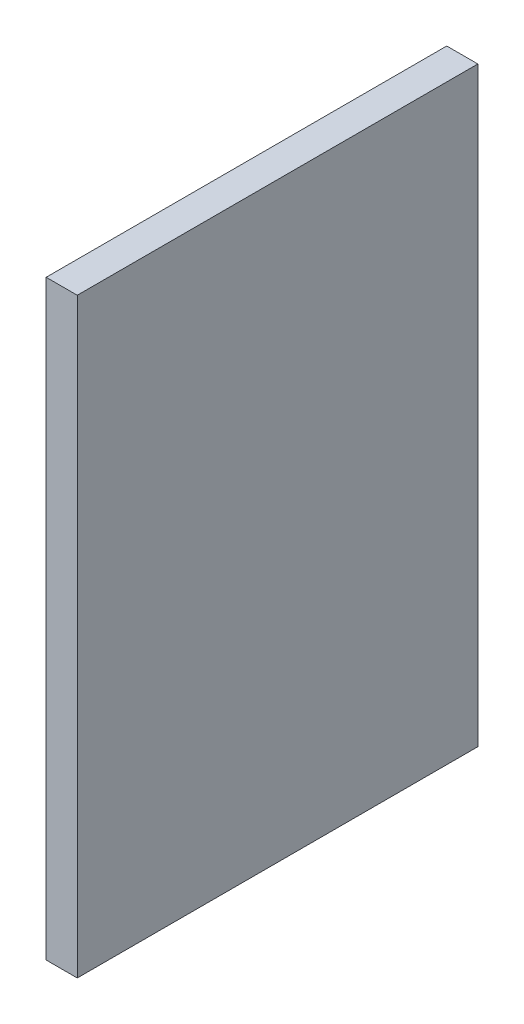
ISO-10303-21;
HEADER;
FILE_DESCRIPTION(('STEP AP214'),'2;1');
FILE_NAME('part.step','',(''),(''),'','','');
FILE_SCHEMA(('AUTOMOTIVE_DESIGN { 1 0 10303 214 1 1 1 1 }'));
ENDSEC;
DATA;
#1=APPLICATION_CONTEXT('core data for automotive mechanical design processes');
#2=APPLICATION_PROTOCOL_DEFINITION('international standard','automotive_design',2000,#1);
#3=PRODUCT_CONTEXT('',#1,'mechanical');
#4=PRODUCT('Part','Part','',(#3));
#5=PRODUCT_RELATED_PRODUCT_CATEGORY('part','',(#4));
#6=PRODUCT_DEFINITION_FORMATION('','',#4);
#7=PRODUCT_DEFINITION_CONTEXT('part definition',#1,'design');
#8=PRODUCT_DEFINITION('design','',#6,#7);
#9=PRODUCT_DEFINITION_SHAPE('','',#8);
#10=(LENGTH_UNIT() NAMED_UNIT(*) SI_UNIT(.MILLI.,.METRE.));
#11=(NAMED_UNIT(*) PLANE_ANGLE_UNIT() SI_UNIT($,.RADIAN.));
#12=(NAMED_UNIT(*) SI_UNIT($,.STERADIAN.) SOLID_ANGLE_UNIT());
#13=UNCERTAINTY_MEASURE_WITH_UNIT(LENGTH_MEASURE(1.E-05),#10,'distance_accuracy_value','');
#14=(GEOMETRIC_REPRESENTATION_CONTEXT(3) GLOBAL_UNCERTAINTY_ASSIGNED_CONTEXT((#13)) GLOBAL_UNIT_ASSIGNED_CONTEXT((#10,
#11,#12)) REPRESENTATION_CONTEXT('',''));
#15=CARTESIAN_POINT('',(0.,0.,0.));
#16=DIRECTION('',(0.,0.,1.));
#17=DIRECTION('',(1.,0.,0.));
#18=AXIS2_PLACEMENT_3D('',#15,#16,#17);
#19=CARTESIAN_POINT('',(1.5875,165.1,-19.05));
#20=DIRECTION('',(1.,0.,0.));
#21=DIRECTION('',(0.,0.,-1.));
#22=AXIS2_PLACEMENT_3D('',#19,#20,#21);
#23=PLANE('',#22);
#24=DIRECTION('',(0.,0.,1.));
#25=VECTOR('',#24,1.);
#26=CARTESIAN_POINT('',(1.5875,0.,-19.05));
#27=LINE('',#26,#25);
#28=CARTESIAN_POINT('',(1.5875,0.,-20.4343));
#29=VERTEX_POINT('',#28);
#30=CARTESIAN_POINT('',(1.5875,0.,20.4343));
#31=VERTEX_POINT('',#30);
#32=EDGE_CURVE('E69',#29,#31,#27,.T.);
#33=ORIENTED_EDGE('',*,*,#32,.F.);
#34=DIRECTION('',(0.,-1.,0.));
#35=VECTOR('',#34,1.);
#36=CARTESIAN_POINT('',(1.5875,165.1,-20.4343));
#37=LINE('',#36,#35);
#38=CARTESIAN_POINT('',(1.5875,60.325,-20.4343));
#39=VERTEX_POINT('',#38);
#40=EDGE_CURVE('E33',#39,#29,#37,.T.);
#41=ORIENTED_EDGE('',*,*,#40,.F.);
#42=DIRECTION('',(0.,0.,1.));
#43=VECTOR('',#42,1.);
#44=CARTESIAN_POINT('',(1.5875,60.325,-19.05));
#45=LINE('',#44,#43);
#46=CARTESIAN_POINT('',(1.5875,60.325,20.4343));
#47=VERTEX_POINT('',#46);
#48=EDGE_CURVE('E73',#39,#47,#45,.T.);
#49=ORIENTED_EDGE('',*,*,#48,.T.);
#50=DIRECTION('',(0.,-1.,0.));
#51=VECTOR('',#50,1.);
#52=CARTESIAN_POINT('',(1.5875,165.1,20.4343));
#53=LINE('',#52,#51);
#54=EDGE_CURVE('E10',#47,#31,#53,.T.);
#55=ORIENTED_EDGE('',*,*,#54,.T.);
#56=EDGE_LOOP('',(#33,#41,#49,#55));
#57=FACE_BOUND('',#56,.T.);
#58=ADVANCED_FACE('F16',(#57),#23,.T.);
#59=CARTESIAN_POINT('',(1.5875,165.1,20.4343));
#60=DIRECTION('',(0.,0.,1.));
#61=DIRECTION('',(1.,0.,0.));
#62=AXIS2_PLACEMENT_3D('',#59,#60,#61);
#63=PLANE('',#62);
#64=DIRECTION('',(-1.,0.,0.));
#65=VECTOR('',#64,1.);
#66=CARTESIAN_POINT('',(1.5875,0.,20.4343));
#67=LINE('',#66,#65);
#68=CARTESIAN_POINT('',(-1.5875,0.,20.4343));
#69=VERTEX_POINT('',#68);
#70=EDGE_CURVE('E76',#31,#69,#67,.T.);
#71=ORIENTED_EDGE('',*,*,#70,.F.);
#72=ORIENTED_EDGE('',*,*,#54,.F.);
#73=DIRECTION('',(-1.,0.,0.));
#74=VECTOR('',#73,1.);
#75=CARTESIAN_POINT('',(1.5875,60.325,20.4343));
#76=LINE('',#75,#74);
#77=CARTESIAN_POINT('',(-1.5875,60.325,20.4343));
#78=VERTEX_POINT('',#77);
#79=EDGE_CURVE('E85',#47,#78,#76,.T.);
#80=ORIENTED_EDGE('',*,*,#79,.T.);
#81=DIRECTION('',(0.,-1.,0.));
#82=VECTOR('',#81,1.);
#83=CARTESIAN_POINT('',(-1.5875,165.1,20.4343));
#84=LINE('',#83,#82);
#85=EDGE_CURVE('E25',#78,#69,#84,.T.);
#86=ORIENTED_EDGE('',*,*,#85,.T.);
#87=EDGE_LOOP('',(#71,#72,#80,#86));
#88=FACE_BOUND('',#87,.T.);
#89=ADVANCED_FACE('F18',(#88),#63,.T.);
#90=CARTESIAN_POINT('',(-1.5875,165.1,19.05));
#91=DIRECTION('',(-1.,0.,0.));
#92=DIRECTION('',(0.,0.,1.));
#93=AXIS2_PLACEMENT_3D('',#90,#91,#92);
#94=PLANE('',#93);
#95=DIRECTION('',(0.,0.,-1.));
#96=VECTOR('',#95,1.);
#97=CARTESIAN_POINT('',(-1.5875,0.,19.05));
#98=LINE('',#97,#96);
#99=CARTESIAN_POINT('',(-1.5875,0.,-20.4343));
#100=VERTEX_POINT('',#99);
#101=EDGE_CURVE('E71',#69,#100,#98,.T.);
#102=ORIENTED_EDGE('',*,*,#101,.F.);
#103=ORIENTED_EDGE('',*,*,#85,.F.);
#104=DIRECTION('',(0.,0.,-1.));
#105=VECTOR('',#104,1.);
#106=CARTESIAN_POINT('',(-1.5875,60.325,19.05));
#107=LINE('',#106,#105);
#108=CARTESIAN_POINT('',(-1.5875,60.325,-20.4343));
#109=VERTEX_POINT('',#108);
#110=EDGE_CURVE('E86',#78,#109,#107,.T.);
#111=ORIENTED_EDGE('',*,*,#110,.T.);
#112=DIRECTION('',(0.,-1.,0.));
#113=VECTOR('',#112,1.);
#114=CARTESIAN_POINT('',(-1.5875,165.1,-20.4343));
#115=LINE('',#114,#113);
#116=EDGE_CURVE('E63',#109,#100,#115,.T.);
#117=ORIENTED_EDGE('',*,*,#116,.T.);
#118=EDGE_LOOP('',(#102,#103,#111,#117));
#119=FACE_BOUND('',#118,.T.);
#120=ADVANCED_FACE('F95',(#119),#94,.T.);
#121=CARTESIAN_POINT('',(-1.5875,165.1,-20.4343));
#122=DIRECTION('',(0.,0.,-1.));
#123=DIRECTION('',(-1.,0.,0.));
#124=AXIS2_PLACEMENT_3D('',#121,#122,#123);
#125=PLANE('',#124);
#126=DIRECTION('',(1.,0.,0.));
#127=VECTOR('',#126,1.);
#128=CARTESIAN_POINT('',(-1.5875,0.,-20.4343));
#129=LINE('',#128,#127);
#130=EDGE_CURVE('E58',#100,#29,#129,.T.);
#131=ORIENTED_EDGE('',*,*,#130,.F.);
#132=ORIENTED_EDGE('',*,*,#116,.F.);
#133=DIRECTION('',(1.,0.,0.));
#134=VECTOR('',#133,1.);
#135=CARTESIAN_POINT('',(-1.5875,60.325,-20.4343));
#136=LINE('',#135,#134);
#137=EDGE_CURVE('E61',#109,#39,#136,.T.);
#138=ORIENTED_EDGE('',*,*,#137,.T.);
#139=ORIENTED_EDGE('',*,*,#40,.T.);
#140=EDGE_LOOP('',(#131,#132,#138,#139));
#141=FACE_BOUND('',#140,.T.);
#142=ADVANCED_FACE('F57',(#141),#125,.T.);
#143=CARTESIAN_POINT('',(0.,60.325,0.));
#144=DIRECTION('',(0.,-1.,0.));
#145=DIRECTION('',(0.,0.,-1.));
#146=AXIS2_PLACEMENT_3D('',#143,#144,#145);
#147=PLANE('',#146);
#148=ORIENTED_EDGE('',*,*,#48,.F.);
#149=ORIENTED_EDGE('',*,*,#137,.F.);
#150=ORIENTED_EDGE('',*,*,#110,.F.);
#151=ORIENTED_EDGE('',*,*,#79,.F.);
#152=EDGE_LOOP('',(#148,#149,#150,#151));
#153=FACE_BOUND('',#152,.T.);
#154=ADVANCED_FACE('F93',(#153),#147,.F.);
#155=CARTESIAN_POINT('',(0.,0.,0.));
#156=DIRECTION('',(0.,-1.,0.));
#157=DIRECTION('',(0.,0.,-1.));
#158=AXIS2_PLACEMENT_3D('',#155,#156,#157);
#159=PLANE('',#158);
#160=ORIENTED_EDGE('',*,*,#32,.T.);
#161=ORIENTED_EDGE('',*,*,#70,.T.);
#162=ORIENTED_EDGE('',*,*,#101,.T.);
#163=ORIENTED_EDGE('',*,*,#130,.T.);
#164=EDGE_LOOP('',(#160,#161,#162,#163));
#165=FACE_BOUND('',#164,.T.);
#166=ADVANCED_FACE('F67',(#165),#159,.T.);
#167=CLOSED_SHELL('',(#58,#89,#120,#142,#154,#166));
#168=MANIFOLD_SOLID_BREP('B1',#167);
#169=ADVANCED_BREP_SHAPE_REPRESENTATION('',(#18,#168),#14);
#170=SHAPE_DEFINITION_REPRESENTATION(#9,#169);
ENDSEC;
END-ISO-10303-21;
